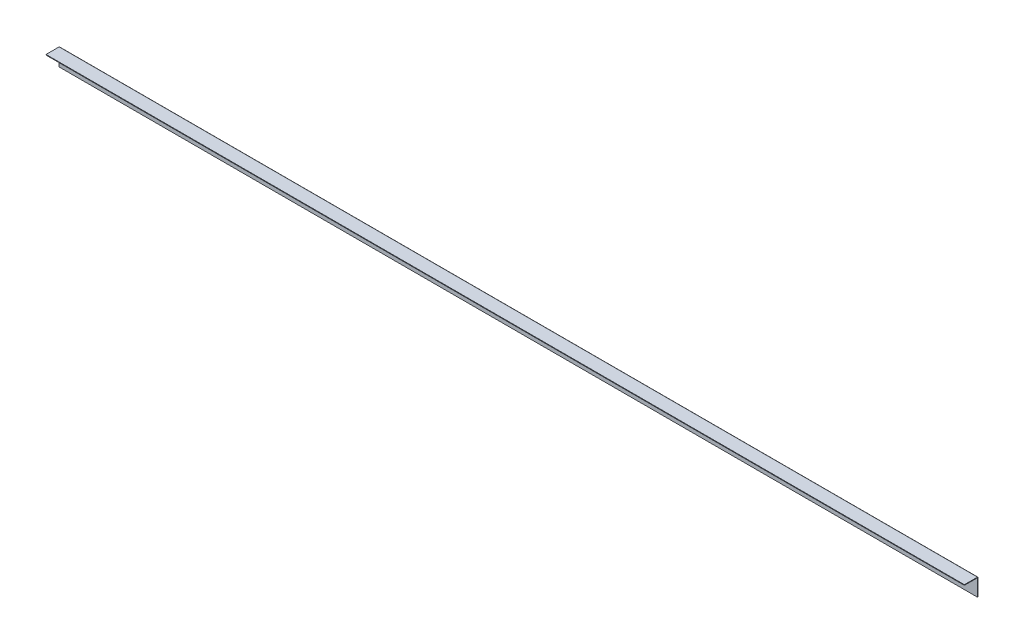
ISO-10303-21;
HEADER;
FILE_DESCRIPTION(('STEP AP214'),'2;1');
FILE_NAME('part.step','',(''),(''),'','','');
FILE_SCHEMA(('AUTOMOTIVE_DESIGN { 1 0 10303 214 1 1 1 1 }'));
ENDSEC;
DATA;
#1=APPLICATION_CONTEXT('core data for automotive mechanical design processes');
#2=APPLICATION_PROTOCOL_DEFINITION('international standard','automotive_design',2000,#1);
#3=PRODUCT_CONTEXT('',#1,'mechanical');
#4=PRODUCT('Part','Part','',(#3));
#5=PRODUCT_RELATED_PRODUCT_CATEGORY('part','',(#4));
#6=PRODUCT_DEFINITION_FORMATION('','',#4);
#7=PRODUCT_DEFINITION_CONTEXT('part definition',#1,'design');
#8=PRODUCT_DEFINITION('design','',#6,#7);
#9=PRODUCT_DEFINITION_SHAPE('','',#8);
#10=(LENGTH_UNIT() NAMED_UNIT(*) SI_UNIT(.MILLI.,.METRE.));
#11=(NAMED_UNIT(*) PLANE_ANGLE_UNIT() SI_UNIT($,.RADIAN.));
#12=(NAMED_UNIT(*) SI_UNIT($,.STERADIAN.) SOLID_ANGLE_UNIT());
#13=UNCERTAINTY_MEASURE_WITH_UNIT(LENGTH_MEASURE(1.E-05),#10,'distance_accuracy_value','');
#14=(GEOMETRIC_REPRESENTATION_CONTEXT(3) GLOBAL_UNCERTAINTY_ASSIGNED_CONTEXT((#13)) GLOBAL_UNIT_ASSIGNED_CONTEXT((#10,
#11,#12)) REPRESENTATION_CONTEXT('',''));
#15=CARTESIAN_POINT('',(0.,0.,0.));
#16=DIRECTION('',(0.,0.,1.));
#17=DIRECTION('',(1.,0.,0.));
#18=AXIS2_PLACEMENT_3D('',#15,#16,#17);
#19=CARTESIAN_POINT('',(4922.,0.,0.));
#20=DIRECTION('',(0.,0.,-1.));
#21=DIRECTION('',(-1.,0.,0.));
#22=AXIS2_PLACEMENT_3D('',#19,#20,#21);
#23=PLANE('',#22);
#24=DIRECTION('',(0.,-1.,0.));
#25=VECTOR('',#24,1.);
#26=CARTESIAN_POINT('',(0.,0.,0.));
#27=LINE('',#26,#25);
#28=CARTESIAN_POINT('',(0.,0.,0.));
#29=VERTEX_POINT('',#28);
#30=CARTESIAN_POINT('',(0.,-3.,0.));
#31=VERTEX_POINT('',#30);
#32=EDGE_CURVE('E115',#29,#31,#27,.T.);
#33=ORIENTED_EDGE('',*,*,#32,.T.);
#34=DIRECTION('',(-1.,0.,0.));
#35=VECTOR('',#34,1.);
#36=CARTESIAN_POINT('',(4922.,-3.,0.));
#37=LINE('',#36,#35);
#38=CARTESIAN_POINT('',(4922.,-3.,0.));
#39=VERTEX_POINT('',#38);
#40=EDGE_CURVE('E99',#39,#31,#37,.T.);
#41=ORIENTED_EDGE('',*,*,#40,.F.);
#42=DIRECTION('',(0.,-1.,0.));
#43=VECTOR('',#42,1.);
#44=CARTESIAN_POINT('',(4922.,0.,0.));
#45=LINE('',#44,#43);
#46=CARTESIAN_POINT('',(4922.,0.,0.));
#47=VERTEX_POINT('',#46);
#48=EDGE_CURVE('E102',#47,#39,#45,.T.);
#49=ORIENTED_EDGE('',*,*,#48,.F.);
#50=DIRECTION('',(-1.,0.,0.));
#51=VECTOR('',#50,1.);
#52=CARTESIAN_POINT('',(4922.,0.,0.));
#53=LINE('',#52,#51);
#54=EDGE_CURVE('E156',#47,#29,#53,.T.);
#55=ORIENTED_EDGE('',*,*,#54,.T.);
#56=EDGE_LOOP('',(#33,#41,#49,#55));
#57=FACE_BOUND('',#56,.T.);
#58=ADVANCED_FACE('F33',(#57),#23,.F.);
#59=CARTESIAN_POINT('',(4922.,-3.,0.));
#60=DIRECTION('',(0.,1.,0.));
#61=DIRECTION('',(0.,0.,1.));
#62=AXIS2_PLACEMENT_3D('',#59,#60,#61);
#63=PLANE('',#62);
#64=DIRECTION('',(0.,0.,-1.));
#65=VECTOR('',#64,1.);
#66=CARTESIAN_POINT('',(0.,-3.,0.));
#67=LINE('',#66,#65);
#68=CARTESIAN_POINT('',(0.,-3.,-67.));
#69=VERTEX_POINT('',#68);
#70=EDGE_CURVE('E139',#31,#69,#67,.T.);
#71=ORIENTED_EDGE('',*,*,#70,.T.);
#72=DIRECTION('',(-1.,0.,0.));
#73=VECTOR('',#72,1.);
#74=CARTESIAN_POINT('',(4922.,-3.,-67.));
#75=LINE('',#74,#73);
#76=CARTESIAN_POINT('',(4922.,-3.,-67.));
#77=VERTEX_POINT('',#76);
#78=EDGE_CURVE('E54',#69,#77,#75,.F.);
#79=ORIENTED_EDGE('',*,*,#78,.T.);
#80=DIRECTION('',(0.,0.,-1.));
#81=VECTOR('',#80,1.);
#82=CARTESIAN_POINT('',(4922.,-3.,0.));
#83=LINE('',#82,#81);
#84=EDGE_CURVE('E95',#39,#77,#83,.T.);
#85=ORIENTED_EDGE('',*,*,#84,.F.);
#86=ORIENTED_EDGE('',*,*,#40,.T.);
#87=EDGE_LOOP('',(#71,#79,#85,#86));
#88=FACE_BOUND('',#87,.T.);
#89=ADVANCED_FACE('F97',(#88),#63,.F.);
#90=CARTESIAN_POINT('',(4922.,-3.,-70.));
#91=DIRECTION('',(0.,0.,-1.));
#92=DIRECTION('',(-1.,0.,0.));
#93=AXIS2_PLACEMENT_3D('',#90,#91,#92);
#94=PLANE('',#93);
#95=DIRECTION('',(0.,-1.,0.));
#96=VECTOR('',#95,1.);
#97=CARTESIAN_POINT('',(4922.,-3.,-70.));
#98=LINE('',#97,#96);
#99=CARTESIAN_POINT('',(4922.,-6.,-70.));
#100=VERTEX_POINT('',#99);
#101=CARTESIAN_POINT('',(4922.,-93.,-70.));
#102=VERTEX_POINT('',#101);
#103=EDGE_CURVE('E101',#100,#102,#98,.T.);
#104=ORIENTED_EDGE('',*,*,#103,.F.);
#105=DIRECTION('',(-1.,0.,0.));
#106=VECTOR('',#105,1.);
#107=CARTESIAN_POINT('',(0.,-6.,-70.));
#108=LINE('',#107,#106);
#109=CARTESIAN_POINT('',(0.,-6.,-70.));
#110=VERTEX_POINT('',#109);
#111=EDGE_CURVE('E132',#100,#110,#108,.T.);
#112=ORIENTED_EDGE('',*,*,#111,.T.);
#113=DIRECTION('',(0.,-1.,0.));
#114=VECTOR('',#113,1.);
#115=CARTESIAN_POINT('',(0.,-3.,-70.));
#116=LINE('',#115,#114);
#117=CARTESIAN_POINT('',(0.,-93.,-70.));
#118=VERTEX_POINT('',#117);
#119=EDGE_CURVE('E141',#110,#118,#116,.T.);
#120=ORIENTED_EDGE('',*,*,#119,.T.);
#121=DIRECTION('',(-1.,0.,0.));
#122=VECTOR('',#121,1.);
#123=CARTESIAN_POINT('',(4922.,-93.,-70.));
#124=LINE('',#123,#122);
#125=EDGE_CURVE('E117',#102,#118,#124,.T.);
#126=ORIENTED_EDGE('',*,*,#125,.F.);
#127=EDGE_LOOP('',(#104,#112,#120,#126));
#128=FACE_BOUND('',#127,.T.);
#129=ADVANCED_FACE('F146',(#128),#94,.F.);
#130=CARTESIAN_POINT('',(4922.,-93.,-70.));
#131=DIRECTION('',(0.,1.,0.));
#132=DIRECTION('',(0.,0.,1.));
#133=AXIS2_PLACEMENT_3D('',#130,#131,#132);
#134=PLANE('',#133);
#135=DIRECTION('',(0.,0.,-1.));
#136=VECTOR('',#135,1.);
#137=CARTESIAN_POINT('',(0.,-93.,-70.));
#138=LINE('',#137,#136);
#139=CARTESIAN_POINT('',(0.,-93.,-73.));
#140=VERTEX_POINT('',#139);
#141=EDGE_CURVE('E159',#118,#140,#138,.T.);
#142=ORIENTED_EDGE('',*,*,#141,.T.);
#143=DIRECTION('',(-1.,0.,0.));
#144=VECTOR('',#143,1.);
#145=CARTESIAN_POINT('',(4922.,-93.,-73.));
#146=LINE('',#145,#144);
#147=CARTESIAN_POINT('',(4922.,-93.,-73.));
#148=VERTEX_POINT('',#147);
#149=EDGE_CURVE('E123',#148,#140,#146,.T.);
#150=ORIENTED_EDGE('',*,*,#149,.F.);
#151=DIRECTION('',(0.,0.,-1.));
#152=VECTOR('',#151,1.);
#153=CARTESIAN_POINT('',(4922.,-93.,-70.));
#154=LINE('',#153,#152);
#155=EDGE_CURVE('E149',#102,#148,#154,.T.);
#156=ORIENTED_EDGE('',*,*,#155,.F.);
#157=ORIENTED_EDGE('',*,*,#125,.T.);
#158=EDGE_LOOP('',(#142,#150,#156,#157));
#159=FACE_BOUND('',#158,.T.);
#160=ADVANCED_FACE('F186',(#159),#134,.F.);
#161=CARTESIAN_POINT('',(4922.,0.,-73.));
#162=DIRECTION('',(0.,0.,1.));
#163=DIRECTION('',(1.,0.,0.));
#164=AXIS2_PLACEMENT_3D('',#161,#162,#163);
#165=PLANE('',#164);
#166=DIRECTION('',(0.,1.,0.));
#167=VECTOR('',#166,1.);
#168=CARTESIAN_POINT('',(0.,0.,-73.));
#169=LINE('',#168,#167);
#170=CARTESIAN_POINT('',(0.,-3.,-73.));
#171=VERTEX_POINT('',#170);
#172=EDGE_CURVE('E161',#140,#171,#169,.T.);
#173=ORIENTED_EDGE('',*,*,#172,.T.);
#174=DIRECTION('',(-1.,0.,0.));
#175=VECTOR('',#174,1.);
#176=CARTESIAN_POINT('',(4922.,-3.,-73.));
#177=LINE('',#176,#175);
#178=CARTESIAN_POINT('',(4922.,-3.,-73.));
#179=VERTEX_POINT('',#178);
#180=EDGE_CURVE('E128',#171,#179,#177,.F.);
#181=ORIENTED_EDGE('',*,*,#180,.T.);
#182=DIRECTION('',(0.,1.,0.));
#183=VECTOR('',#182,1.);
#184=CARTESIAN_POINT('',(4922.,0.,-73.));
#185=LINE('',#184,#183);
#186=EDGE_CURVE('E151',#148,#179,#185,.T.);
#187=ORIENTED_EDGE('',*,*,#186,.F.);
#188=ORIENTED_EDGE('',*,*,#149,.T.);
#189=EDGE_LOOP('',(#173,#181,#187,#188));
#190=FACE_BOUND('',#189,.T.);
#191=ADVANCED_FACE('F170',(#190),#165,.F.);
#192=CARTESIAN_POINT('',(4922.,0.,0.));
#193=DIRECTION('',(0.,-1.,0.));
#194=DIRECTION('',(0.,0.,-1.));
#195=AXIS2_PLACEMENT_3D('',#192,#193,#194);
#196=PLANE('',#195);
#197=DIRECTION('',(0.,0.,1.));
#198=VECTOR('',#197,1.);
#199=CARTESIAN_POINT('',(4922.,0.,0.));
#200=LINE('',#199,#198);
#201=CARTESIAN_POINT('',(4922.,0.,-70.));
#202=VERTEX_POINT('',#201);
#203=EDGE_CURVE('E108',#202,#47,#200,.T.);
#204=ORIENTED_EDGE('',*,*,#203,.F.);
#205=DIRECTION('',(-1.,0.,0.));
#206=VECTOR('',#205,1.);
#207=CARTESIAN_POINT('',(4922.,0.,-70.));
#208=LINE('',#207,#206);
#209=CARTESIAN_POINT('',(0.,0.,-70.));
#210=VERTEX_POINT('',#209);
#211=EDGE_CURVE('E116',#202,#210,#208,.T.);
#212=ORIENTED_EDGE('',*,*,#211,.T.);
#213=DIRECTION('',(0.,0.,1.));
#214=VECTOR('',#213,1.);
#215=CARTESIAN_POINT('',(0.,0.,0.));
#216=LINE('',#215,#214);
#217=EDGE_CURVE('E112',#210,#29,#216,.T.);
#218=ORIENTED_EDGE('',*,*,#217,.T.);
#219=ORIENTED_EDGE('',*,*,#54,.F.);
#220=EDGE_LOOP('',(#204,#212,#218,#219));
#221=FACE_BOUND('',#220,.T.);
#222=ADVANCED_FACE('F178',(#221),#196,.F.);
#223=CARTESIAN_POINT('',(4922.,0.,0.));
#224=DIRECTION('',(1.,0.,0.));
#225=DIRECTION('',(0.,0.,-1.));
#226=AXIS2_PLACEMENT_3D('',#223,#224,#225);
#227=PLANE('',#226);
#228=ORIENTED_EDGE('',*,*,#186,.T.);
#229=CARTESIAN_POINT('',(4922.,-3.,-70.));
#230=DIRECTION('',(1.,0.,0.));
#231=DIRECTION('',(0.,0.,-1.));
#232=AXIS2_PLACEMENT_3D('',#229,#230,#231);
#233=CIRCLE('',#232,3.);
#234=EDGE_CURVE('E130',#179,#202,#233,.T.);
#235=ORIENTED_EDGE('',*,*,#234,.T.);
#236=ORIENTED_EDGE('',*,*,#203,.T.);
#237=ORIENTED_EDGE('',*,*,#48,.T.);
#238=ORIENTED_EDGE('',*,*,#84,.T.);
#239=CARTESIAN_POINT('',(4922.,-6.,-67.));
#240=DIRECTION('',(1.,0.,0.));
#241=DIRECTION('',(0.,0.,-1.));
#242=AXIS2_PLACEMENT_3D('',#239,#240,#241);
#243=CIRCLE('',#242,3.);
#244=EDGE_CURVE('E11',#77,#100,#243,.F.);
#245=ORIENTED_EDGE('',*,*,#244,.T.);
#246=ORIENTED_EDGE('',*,*,#103,.T.);
#247=ORIENTED_EDGE('',*,*,#155,.T.);
#248=EDGE_LOOP('',(#228,#235,#236,#237,#238,#245,#246,#247));
#249=FACE_BOUND('',#248,.T.);
#250=ADVANCED_FACE('F106',(#249),#227,.T.);
#251=CARTESIAN_POINT('',(0.,0.,0.));
#252=DIRECTION('',(1.,0.,0.));
#253=DIRECTION('',(0.,0.,-1.));
#254=AXIS2_PLACEMENT_3D('',#251,#252,#253);
#255=PLANE('',#254);
#256=ORIENTED_EDGE('',*,*,#217,.F.);
#257=CARTESIAN_POINT('',(0.,-3.,-70.));
#258=DIRECTION('',(1.,0.,0.));
#259=DIRECTION('',(0.,0.,-1.));
#260=AXIS2_PLACEMENT_3D('',#257,#258,#259);
#261=CIRCLE('',#260,3.);
#262=EDGE_CURVE('E120',#210,#171,#261,.F.);
#263=ORIENTED_EDGE('',*,*,#262,.T.);
#264=ORIENTED_EDGE('',*,*,#172,.F.);
#265=ORIENTED_EDGE('',*,*,#141,.F.);
#266=ORIENTED_EDGE('',*,*,#119,.F.);
#267=CARTESIAN_POINT('',(0.,-6.,-67.));
#268=DIRECTION('',(1.,0.,0.));
#269=DIRECTION('',(0.,0.,-1.));
#270=AXIS2_PLACEMENT_3D('',#267,#268,#269);
#271=CIRCLE('',#270,3.);
#272=EDGE_CURVE('E41',#110,#69,#271,.T.);
#273=ORIENTED_EDGE('',*,*,#272,.T.);
#274=ORIENTED_EDGE('',*,*,#70,.F.);
#275=ORIENTED_EDGE('',*,*,#32,.F.);
#276=EDGE_LOOP('',(#256,#263,#264,#265,#266,#273,#274,#275));
#277=FACE_BOUND('',#276,.T.);
#278=ADVANCED_FACE('F138',(#277),#255,.F.);
#279=CARTESIAN_POINT('',(4922.,-3.,-70.));
#280=DIRECTION('',(-1.,0.,0.));
#281=DIRECTION('',(0.,0.,1.));
#282=AXIS2_PLACEMENT_3D('',#279,#280,#281);
#283=CYLINDRICAL_SURFACE('',#282,3.);
#284=ORIENTED_EDGE('',*,*,#234,.F.);
#285=ORIENTED_EDGE('',*,*,#180,.F.);
#286=ORIENTED_EDGE('',*,*,#262,.F.);
#287=ORIENTED_EDGE('',*,*,#211,.F.);
#288=EDGE_LOOP('',(#284,#285,#286,#287));
#289=FACE_BOUND('',#288,.T.);
#290=ADVANCED_FACE('F176',(#289),#283,.T.);
#291=CARTESIAN_POINT('',(4922.,-6.,-67.));
#292=DIRECTION('',(1.,0.,0.));
#293=DIRECTION('',(0.,0.,-1.));
#294=AXIS2_PLACEMENT_3D('',#291,#292,#293);
#295=CYLINDRICAL_SURFACE('',#294,3.);
#296=ORIENTED_EDGE('',*,*,#244,.F.);
#297=ORIENTED_EDGE('',*,*,#78,.F.);
#298=ORIENTED_EDGE('',*,*,#272,.F.);
#299=ORIENTED_EDGE('',*,*,#111,.F.);
#300=EDGE_LOOP('',(#296,#297,#298,#299));
#301=FACE_BOUND('',#300,.T.);
#302=ADVANCED_FACE('F35',(#301),#295,.F.);
#303=CLOSED_SHELL('',(#58,#89,#129,#160,#191,#222,#250,#278,#290,#302));
#304=MANIFOLD_SOLID_BREP('B2',#303);
#305=ADVANCED_BREP_SHAPE_REPRESENTATION('',(#18,#304),#14);
#306=SHAPE_DEFINITION_REPRESENTATION(#9,#305);
ENDSEC;
END-ISO-10303-21;
